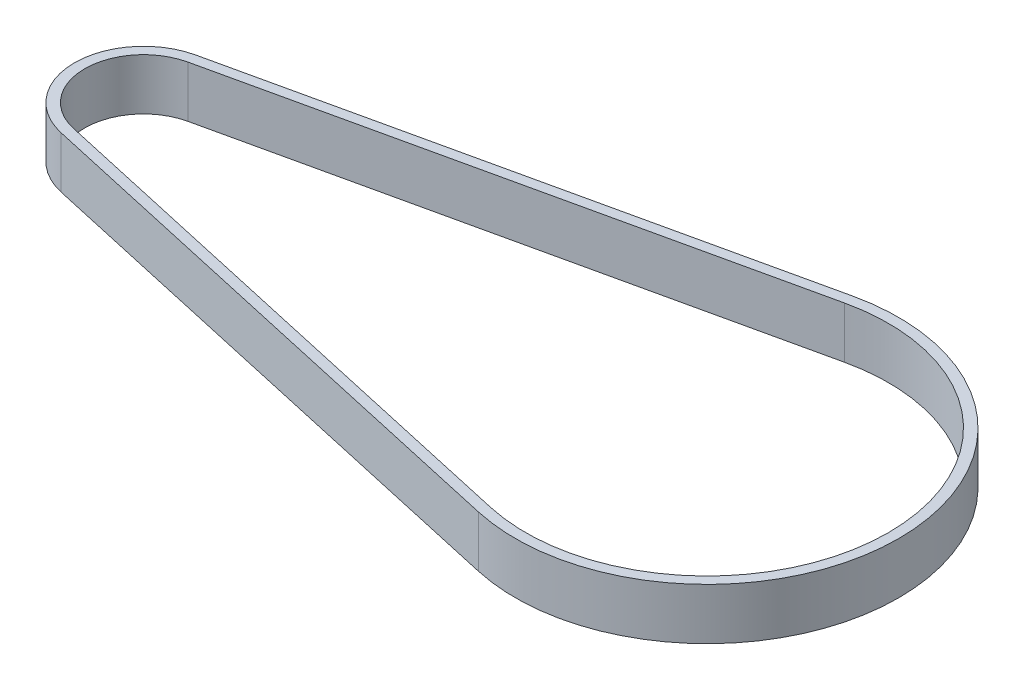
ISO-10303-21;
HEADER;
FILE_DESCRIPTION(('STEP AP214'),'2;1');
FILE_NAME('part.step','',(''),(''),'','','');
FILE_SCHEMA(('AUTOMOTIVE_DESIGN { 1 0 10303 214 1 1 1 1 }'));
ENDSEC;
DATA;
#1=APPLICATION_CONTEXT('core data for automotive mechanical design processes');
#2=APPLICATION_PROTOCOL_DEFINITION('international standard','automotive_design',2000,#1);
#3=PRODUCT_CONTEXT('',#1,'mechanical');
#4=PRODUCT('Part','Part','',(#3));
#5=PRODUCT_RELATED_PRODUCT_CATEGORY('part','',(#4));
#6=PRODUCT_DEFINITION_FORMATION('','',#4);
#7=PRODUCT_DEFINITION_CONTEXT('part definition',#1,'design');
#8=PRODUCT_DEFINITION('design','',#6,#7);
#9=PRODUCT_DEFINITION_SHAPE('','',#8);
#10=(LENGTH_UNIT() NAMED_UNIT(*) SI_UNIT(.MILLI.,.METRE.));
#11=(NAMED_UNIT(*) PLANE_ANGLE_UNIT() SI_UNIT($,.RADIAN.));
#12=(NAMED_UNIT(*) SI_UNIT($,.STERADIAN.) SOLID_ANGLE_UNIT());
#13=UNCERTAINTY_MEASURE_WITH_UNIT(LENGTH_MEASURE(1.E-05),#10,'distance_accuracy_value','');
#14=(GEOMETRIC_REPRESENTATION_CONTEXT(3) GLOBAL_UNCERTAINTY_ASSIGNED_CONTEXT((#13)) GLOBAL_UNIT_ASSIGNED_CONTEXT((#10,
#11,#12)) REPRESENTATION_CONTEXT('',''));
#15=CARTESIAN_POINT('',(0.,0.,0.));
#16=DIRECTION('',(0.,0.,1.));
#17=DIRECTION('',(1.,0.,0.));
#18=AXIS2_PLACEMENT_3D('',#15,#16,#17);
#19=CARTESIAN_POINT('',(0.,-2.,0.));
#20=DIRECTION('',(0.,1.,0.));
#21=DIRECTION('',(0.,0.,1.));
#22=AXIS2_PLACEMENT_3D('',#19,#20,#21);
#23=CYLINDRICAL_SURFACE('',#22,5.375);
#24=DIRECTION('',(0.,1.,0.));
#25=VECTOR('',#24,1.);
#26=CARTESIAN_POINT('',(-1.16927676537585,-2.,5.24627647441042));
#27=LINE('',#26,#25);
#28=CARTESIAN_POINT('',(-1.16927676537585,-2.,5.24627647441042));
#29=VERTEX_POINT('',#28);
#30=CARTESIAN_POINT('',(-1.16927676537585,2.,5.24627647441042));
#31=VERTEX_POINT('',#30);
#32=EDGE_CURVE('E87',#29,#31,#27,.T.);
#33=ORIENTED_EDGE('',*,*,#32,.T.);
#34=CARTESIAN_POINT('',(0.,2.,0.));
#35=DIRECTION('',(0.,1.,0.));
#36=DIRECTION('',(1.,0.,0.));
#37=AXIS2_PLACEMENT_3D('',#34,#35,#36);
#38=CIRCLE('',#37,5.375);
#39=CARTESIAN_POINT('',(-1.16927676537585,2.,-5.24627647441042));
#40=VERTEX_POINT('',#39);
#41=EDGE_CURVE('E179',#40,#31,#38,.T.);
#42=ORIENTED_EDGE('',*,*,#41,.F.);
#43=DIRECTION('',(0.,1.,0.));
#44=VECTOR('',#43,1.);
#45=CARTESIAN_POINT('',(-1.16927676537585,-2.,-5.24627647441042));
#46=LINE('',#45,#44);
#47=CARTESIAN_POINT('',(-1.16927676537585,-2.,-5.24627647441042));
#48=VERTEX_POINT('',#47);
#49=EDGE_CURVE('E12',#48,#40,#46,.T.);
#50=ORIENTED_EDGE('',*,*,#49,.F.);
#51=CARTESIAN_POINT('',(0.,-2.,0.));
#52=DIRECTION('',(0.,1.,0.));
#53=DIRECTION('',(1.,0.,0.));
#54=AXIS2_PLACEMENT_3D('',#51,#52,#53);
#55=CIRCLE('',#54,5.375);
#56=EDGE_CURVE('E198',#48,#29,#55,.T.);
#57=ORIENTED_EDGE('',*,*,#56,.T.);
#58=EDGE_LOOP('',(#33,#42,#50,#57));
#59=FACE_BOUND('',#58,.T.);
#60=ADVANCED_FACE('F84',(#59),#23,.T.);
#61=CARTESIAN_POINT('',(-1.16927676537585,-2.,-5.24627647441042));
#62=DIRECTION('',(-0.21753986332574,0.,-0.976051437099612));
#63=DIRECTION('',(-0.976051437099612,0.,0.21753986332574));
#64=AXIS2_PLACEMENT_3D('',#61,#62,#63);
#65=PLANE('',#64);
#66=ORIENTED_EDGE('',*,*,#49,.T.);
#67=DIRECTION('',(-0.976051437099612,0.,0.21753986332574));
#68=VECTOR('',#67,1.);
#69=CARTESIAN_POINT('',(-1.16927676537585,2.,-5.24627647441042));
#70=LINE('',#69,#68);
#71=CARTESIAN_POINT('',(40.6532175398633,2.,-14.5675676987117));
#72=VERTEX_POINT('',#71);
#73=EDGE_CURVE('E188',#72,#40,#70,.T.);
#74=ORIENTED_EDGE('',*,*,#73,.F.);
#75=DIRECTION('',(0.,1.,0.));
#76=VECTOR('',#75,1.);
#77=CARTESIAN_POINT('',(40.6532175398633,-2.,-14.5675676987117));
#78=LINE('',#77,#76);
#79=CARTESIAN_POINT('',(40.6532175398633,-2.,-14.5675676987117));
#80=VERTEX_POINT('',#79);
#81=EDGE_CURVE('E92',#80,#72,#78,.T.);
#82=ORIENTED_EDGE('',*,*,#81,.F.);
#83=DIRECTION('',(-0.976051437099612,0.,0.21753986332574));
#84=VECTOR('',#83,1.);
#85=CARTESIAN_POINT('',(-1.16927676537585,-2.,-5.24627647441042));
#86=LINE('',#85,#84);
#87=EDGE_CURVE('E209',#80,#48,#86,.T.);
#88=ORIENTED_EDGE('',*,*,#87,.T.);
#89=EDGE_LOOP('',(#66,#74,#82,#88));
#90=FACE_BOUND('',#89,.T.);
#91=ADVANCED_FACE('F221',(#90),#65,.T.);
#92=CARTESIAN_POINT('',(43.9,-2.,0.));
#93=DIRECTION('',(0.,1.,0.));
#94=DIRECTION('',(0.,0.,1.));
#95=AXIS2_PLACEMENT_3D('',#92,#93,#94);
#96=CYLINDRICAL_SURFACE('',#95,14.925);
#97=ORIENTED_EDGE('',*,*,#81,.T.);
#98=CARTESIAN_POINT('',(43.9,2.,0.));
#99=DIRECTION('',(0.,1.,0.));
#100=DIRECTION('',(1.,0.,0.));
#101=AXIS2_PLACEMENT_3D('',#98,#99,#100);
#102=CIRCLE('',#101,14.925);
#103=CARTESIAN_POINT('',(40.6532175398633,2.,14.5675676987117));
#104=VERTEX_POINT('',#103);
#105=EDGE_CURVE('E185',#104,#72,#102,.T.);
#106=ORIENTED_EDGE('',*,*,#105,.F.);
#107=DIRECTION('',(0.,1.,0.));
#108=VECTOR('',#107,1.);
#109=CARTESIAN_POINT('',(40.6532175398633,-2.,14.5675676987117));
#110=LINE('',#109,#108);
#111=CARTESIAN_POINT('',(40.6532175398633,-2.,14.5675676987117));
#112=VERTEX_POINT('',#111);
#113=EDGE_CURVE('E212',#112,#104,#110,.T.);
#114=ORIENTED_EDGE('',*,*,#113,.F.);
#115=CARTESIAN_POINT('',(43.9,-2.,0.));
#116=DIRECTION('',(0.,1.,0.));
#117=DIRECTION('',(1.,0.,0.));
#118=AXIS2_PLACEMENT_3D('',#115,#116,#117);
#119=CIRCLE('',#118,14.925);
#120=EDGE_CURVE('E206',#112,#80,#119,.T.);
#121=ORIENTED_EDGE('',*,*,#120,.T.);
#122=EDGE_LOOP('',(#97,#106,#114,#121));
#123=FACE_BOUND('',#122,.T.);
#124=ADVANCED_FACE('F227',(#123),#96,.T.);
#125=CARTESIAN_POINT('',(-1.16927676537585,-2.,5.24627647441042));
#126=DIRECTION('',(-0.21753986332574,0.,0.976051437099612));
#127=DIRECTION('',(0.976051437099612,0.,0.21753986332574));
#128=AXIS2_PLACEMENT_3D('',#125,#126,#127);
#129=PLANE('',#128);
#130=ORIENTED_EDGE('',*,*,#113,.T.);
#131=DIRECTION('',(0.976051437099612,0.,0.21753986332574));
#132=VECTOR('',#131,1.);
#133=CARTESIAN_POINT('',(-1.16927676537585,2.,5.24627647441042));
#134=LINE('',#133,#132);
#135=EDGE_CURVE('E182',#31,#104,#134,.T.);
#136=ORIENTED_EDGE('',*,*,#135,.F.);
#137=ORIENTED_EDGE('',*,*,#32,.F.);
#138=DIRECTION('',(0.976051437099612,0.,0.21753986332574));
#139=VECTOR('',#138,1.);
#140=CARTESIAN_POINT('',(-1.16927676537585,-2.,5.24627647441042));
#141=LINE('',#140,#139);
#142=EDGE_CURVE('E203',#29,#112,#141,.T.);
#143=ORIENTED_EDGE('',*,*,#142,.T.);
#144=EDGE_LOOP('',(#130,#136,#137,#143));
#145=FACE_BOUND('',#144,.T.);
#146=ADVANCED_FACE('F216',(#145),#129,.T.);
#147=CARTESIAN_POINT('',(0.,-2.,0.));
#148=DIRECTION('',(0.,1.,0.));
#149=DIRECTION('',(0.,0.,1.));
#150=AXIS2_PLACEMENT_3D('',#147,#148,#149);
#151=PLANE('',#150);
#152=DIRECTION('',(-0.976051437099612,0.,0.21753986332574));
#153=VECTOR('',#152,1.);
#154=CARTESIAN_POINT('',(-0.995244874715262,-2.,-4.46543532473073));
#155=LINE('',#154,#153);
#156=CARTESIAN_POINT('',(40.8272494305239,-2.,-13.786726549032));
#157=VERTEX_POINT('',#156);
#158=CARTESIAN_POINT('',(-0.995244874715262,-2.,-4.46543532473073));
#159=VERTEX_POINT('',#158);
#160=EDGE_CURVE('E161',#157,#159,#155,.T.);
#161=ORIENTED_EDGE('',*,*,#160,.T.);
#162=CARTESIAN_POINT('',(0.,-2.,0.));
#163=DIRECTION('',(0.,1.,0.));
#164=DIRECTION('',(1.,0.,0.));
#165=AXIS2_PLACEMENT_3D('',#162,#163,#164);
#166=CIRCLE('',#165,4.575);
#167=CARTESIAN_POINT('',(-0.995244874715262,-2.,4.46543532473073));
#168=VERTEX_POINT('',#167);
#169=EDGE_CURVE('E191',#159,#168,#166,.T.);
#170=ORIENTED_EDGE('',*,*,#169,.T.);
#171=DIRECTION('',(0.976051437099612,0.,0.21753986332574));
#172=VECTOR('',#171,1.);
#173=CARTESIAN_POINT('',(-0.995244874715262,-2.,4.46543532473073));
#174=LINE('',#173,#172);
#175=CARTESIAN_POINT('',(40.8272494305239,-2.,13.786726549032));
#176=VERTEX_POINT('',#175);
#177=EDGE_CURVE('E156',#168,#176,#174,.T.);
#178=ORIENTED_EDGE('',*,*,#177,.T.);
#179=CARTESIAN_POINT('',(43.9,-2.,0.));
#180=DIRECTION('',(0.,1.,0.));
#181=DIRECTION('',(1.,0.,0.));
#182=AXIS2_PLACEMENT_3D('',#179,#180,#181);
#183=CIRCLE('',#182,14.125);
#184=EDGE_CURVE('E100',#176,#157,#183,.T.);
#185=ORIENTED_EDGE('',*,*,#184,.T.);
#186=EDGE_LOOP('',(#161,#170,#178,#185));
#187=FACE_BOUND('',#186,.T.);
#188=ORIENTED_EDGE('',*,*,#56,.F.);
#189=ORIENTED_EDGE('',*,*,#87,.F.);
#190=ORIENTED_EDGE('',*,*,#120,.F.);
#191=ORIENTED_EDGE('',*,*,#142,.F.);
#192=EDGE_LOOP('',(#188,#189,#190,#191));
#193=FACE_BOUND('',#192,.T.);
#194=ADVANCED_FACE('F225',(#187,#193),#151,.F.);
#195=CARTESIAN_POINT('',(0.,-2.,0.));
#196=DIRECTION('',(0.,1.,0.));
#197=DIRECTION('',(0.,0.,1.));
#198=AXIS2_PLACEMENT_3D('',#195,#196,#197);
#199=CYLINDRICAL_SURFACE('',#198,4.575);
#200=DIRECTION('',(0.,1.,0.));
#201=VECTOR('',#200,1.);
#202=CARTESIAN_POINT('',(-0.995244874715262,-2.,-4.46543532473073));
#203=LINE('',#202,#201);
#204=CARTESIAN_POINT('',(-0.995244874715262,2.,-4.46543532473073));
#205=VERTEX_POINT('',#204);
#206=EDGE_CURVE('E166',#159,#205,#203,.T.);
#207=ORIENTED_EDGE('',*,*,#206,.T.);
#208=CARTESIAN_POINT('',(0.,2.,0.));
#209=DIRECTION('',(0.,1.,0.));
#210=DIRECTION('',(1.,0.,0.));
#211=AXIS2_PLACEMENT_3D('',#208,#209,#210);
#212=CIRCLE('',#211,4.575);
#213=CARTESIAN_POINT('',(-0.995244874715262,2.,4.46543532473073));
#214=VERTEX_POINT('',#213);
#215=EDGE_CURVE('E164',#205,#214,#212,.T.);
#216=ORIENTED_EDGE('',*,*,#215,.T.);
#217=DIRECTION('',(0.,1.,0.));
#218=VECTOR('',#217,1.);
#219=CARTESIAN_POINT('',(-0.995244874715262,-2.,4.46543532473073));
#220=LINE('',#219,#218);
#221=EDGE_CURVE('E149',#168,#214,#220,.T.);
#222=ORIENTED_EDGE('',*,*,#221,.F.);
#223=ORIENTED_EDGE('',*,*,#169,.F.);
#224=EDGE_LOOP('',(#207,#216,#222,#223));
#225=FACE_BOUND('',#224,.T.);
#226=ADVANCED_FACE('F165',(#225),#199,.F.);
#227=CARTESIAN_POINT('',(-0.995244874715262,-2.,-4.46543532473073));
#228=DIRECTION('',(-0.21753986332574,0.,-0.976051437099612));
#229=DIRECTION('',(-0.976051437099612,0.,0.21753986332574));
#230=AXIS2_PLACEMENT_3D('',#227,#228,#229);
#231=PLANE('',#230);
#232=DIRECTION('',(0.,1.,0.));
#233=VECTOR('',#232,1.);
#234=CARTESIAN_POINT('',(40.8272494305239,-2.,-13.786726549032));
#235=LINE('',#234,#233);
#236=CARTESIAN_POINT('',(40.8272494305239,2.,-13.786726549032));
#237=VERTEX_POINT('',#236);
#238=EDGE_CURVE('E199',#157,#237,#235,.T.);
#239=ORIENTED_EDGE('',*,*,#238,.T.);
#240=DIRECTION('',(-0.976051437099612,0.,0.21753986332574));
#241=VECTOR('',#240,1.);
#242=CARTESIAN_POINT('',(-0.995244874715262,2.,-4.46543532473073));
#243=LINE('',#242,#241);
#244=EDGE_CURVE('E175',#237,#205,#243,.T.);
#245=ORIENTED_EDGE('',*,*,#244,.T.);
#246=ORIENTED_EDGE('',*,*,#206,.F.);
#247=ORIENTED_EDGE('',*,*,#160,.F.);
#248=EDGE_LOOP('',(#239,#245,#246,#247));
#249=FACE_BOUND('',#248,.T.);
#250=ADVANCED_FACE('F270',(#249),#231,.F.);
#251=CARTESIAN_POINT('',(43.9,-2.,0.));
#252=DIRECTION('',(0.,1.,0.));
#253=DIRECTION('',(0.,0.,1.));
#254=AXIS2_PLACEMENT_3D('',#251,#252,#253);
#255=CYLINDRICAL_SURFACE('',#254,14.125);
#256=DIRECTION('',(0.,1.,0.));
#257=VECTOR('',#256,1.);
#258=CARTESIAN_POINT('',(40.8272494305239,-2.,13.786726549032));
#259=LINE('',#258,#257);
#260=CARTESIAN_POINT('',(40.8272494305239,2.,13.786726549032));
#261=VERTEX_POINT('',#260);
#262=EDGE_CURVE('E160',#176,#261,#259,.T.);
#263=ORIENTED_EDGE('',*,*,#262,.T.);
#264=CARTESIAN_POINT('',(43.9,2.,0.));
#265=DIRECTION('',(0.,1.,0.));
#266=DIRECTION('',(1.,0.,0.));
#267=AXIS2_PLACEMENT_3D('',#264,#265,#266);
#268=CIRCLE('',#267,14.125);
#269=EDGE_CURVE('E173',#261,#237,#268,.T.);
#270=ORIENTED_EDGE('',*,*,#269,.T.);
#271=ORIENTED_EDGE('',*,*,#238,.F.);
#272=ORIENTED_EDGE('',*,*,#184,.F.);
#273=EDGE_LOOP('',(#263,#270,#271,#272));
#274=FACE_BOUND('',#273,.T.);
#275=ADVANCED_FACE('F279',(#274),#255,.F.);
#276=CARTESIAN_POINT('',(-0.995244874715262,-2.,4.46543532473073));
#277=DIRECTION('',(-0.21753986332574,0.,0.976051437099612));
#278=DIRECTION('',(0.976051437099612,0.,0.21753986332574));
#279=AXIS2_PLACEMENT_3D('',#276,#277,#278);
#280=PLANE('',#279);
#281=ORIENTED_EDGE('',*,*,#221,.T.);
#282=DIRECTION('',(0.976051437099612,0.,0.21753986332574));
#283=VECTOR('',#282,1.);
#284=CARTESIAN_POINT('',(-0.995244874715262,2.,4.46543532473073));
#285=LINE('',#284,#283);
#286=EDGE_CURVE('E153',#214,#261,#285,.T.);
#287=ORIENTED_EDGE('',*,*,#286,.T.);
#288=ORIENTED_EDGE('',*,*,#262,.F.);
#289=ORIENTED_EDGE('',*,*,#177,.F.);
#290=EDGE_LOOP('',(#281,#287,#288,#289));
#291=FACE_BOUND('',#290,.T.);
#292=ADVANCED_FACE('F151',(#291),#280,.F.);
#293=CARTESIAN_POINT('',(0.,2.,0.));
#294=DIRECTION('',(0.,1.,0.));
#295=DIRECTION('',(0.,0.,1.));
#296=AXIS2_PLACEMENT_3D('',#293,#294,#295);
#297=PLANE('',#296);
#298=ORIENTED_EDGE('',*,*,#41,.T.);
#299=ORIENTED_EDGE('',*,*,#135,.T.);
#300=ORIENTED_EDGE('',*,*,#105,.T.);
#301=ORIENTED_EDGE('',*,*,#73,.T.);
#302=EDGE_LOOP('',(#298,#299,#300,#301));
#303=FACE_BOUND('',#302,.T.);
#304=ORIENTED_EDGE('',*,*,#286,.F.);
#305=ORIENTED_EDGE('',*,*,#215,.F.);
#306=ORIENTED_EDGE('',*,*,#244,.F.);
#307=ORIENTED_EDGE('',*,*,#269,.F.);
#308=EDGE_LOOP('',(#304,#305,#306,#307));
#309=FACE_BOUND('',#308,.T.);
#310=ADVANCED_FACE('F171',(#303,#309),#297,.T.);
#311=CLOSED_SHELL('',(#60,#91,#124,#146,#194,#226,#250,#275,#292,#310));
#312=MANIFOLD_SOLID_BREP('B2',#311);
#313=ADVANCED_BREP_SHAPE_REPRESENTATION('',(#18,#312),#14);
#314=SHAPE_DEFINITION_REPRESENTATION(#9,#313);
ENDSEC;
END-ISO-10303-21;
